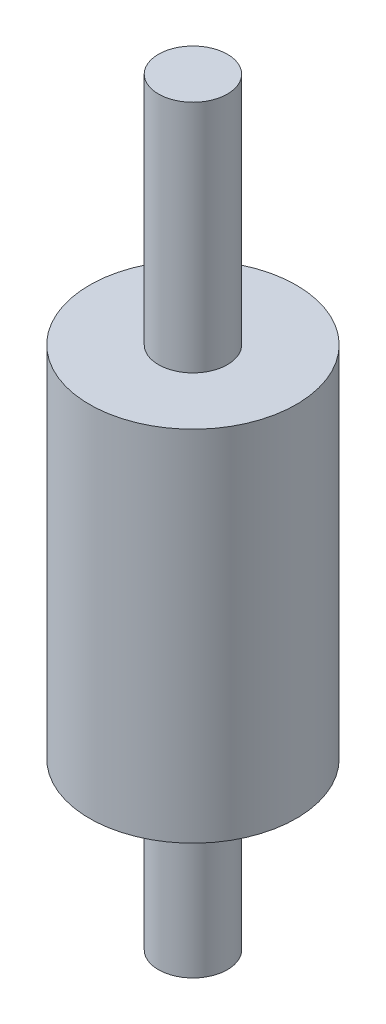
ISO-10303-21;
HEADER;
FILE_DESCRIPTION(('STEP AP214'),'2;1');
FILE_NAME('part.step','',(''),(''),'','','');
FILE_SCHEMA(('AUTOMOTIVE_DESIGN { 1 0 10303 214 1 1 1 1 }'));
ENDSEC;
DATA;
#1=APPLICATION_CONTEXT('core data for automotive mechanical design processes');
#2=APPLICATION_PROTOCOL_DEFINITION('international standard','automotive_design',2000,#1);
#3=PRODUCT_CONTEXT('',#1,'mechanical');
#4=PRODUCT('Part','Part','',(#3));
#5=PRODUCT_RELATED_PRODUCT_CATEGORY('part','',(#4));
#6=PRODUCT_DEFINITION_FORMATION('','',#4);
#7=PRODUCT_DEFINITION_CONTEXT('part definition',#1,'design');
#8=PRODUCT_DEFINITION('design','',#6,#7);
#9=PRODUCT_DEFINITION_SHAPE('','',#8);
#10=(LENGTH_UNIT() NAMED_UNIT(*) SI_UNIT(.MILLI.,.METRE.));
#11=(NAMED_UNIT(*) PLANE_ANGLE_UNIT() SI_UNIT($,.RADIAN.));
#12=(NAMED_UNIT(*) SI_UNIT($,.STERADIAN.) SOLID_ANGLE_UNIT());
#13=UNCERTAINTY_MEASURE_WITH_UNIT(LENGTH_MEASURE(1.E-05),#10,'distance_accuracy_value','');
#14=(GEOMETRIC_REPRESENTATION_CONTEXT(3) GLOBAL_UNCERTAINTY_ASSIGNED_CONTEXT((#13)) GLOBAL_UNIT_ASSIGNED_CONTEXT((#10,
#11,#12)) REPRESENTATION_CONTEXT('',''));
#15=CARTESIAN_POINT('',(0.,0.,0.));
#16=DIRECTION('',(0.,0.,1.));
#17=DIRECTION('',(1.,0.,0.));
#18=AXIS2_PLACEMENT_3D('',#15,#16,#17);
#19=CARTESIAN_POINT('',(0.,-27.5,0.));
#20=DIRECTION('',(0.,-1.,0.));
#21=DIRECTION('',(0.,0.,-1.));
#22=AXIS2_PLACEMENT_3D('',#19,#20,#21);
#23=PLANE('',#22);
#24=CARTESIAN_POINT('',(0.,-27.5,0.));
#25=DIRECTION('',(0.,-1.,0.));
#26=DIRECTION('',(0.,0.,-1.));
#27=AXIS2_PLACEMENT_3D('',#24,#25,#26);
#28=CIRCLE('',#27,2.5);
#29=CARTESIAN_POINT('',(0.,-27.5,-2.5));
#30=VERTEX_POINT('',#29);
#31=EDGE_CURVE('E10',#30,#30,#28,.T.);
#32=ORIENTED_EDGE('',*,*,#31,.T.);
#33=EDGE_LOOP('',(#32));
#34=FACE_BOUND('',#33,.T.);
#35=ADVANCED_FACE('F39',(#34),#23,.T.);
#36=CARTESIAN_POINT('',(0.,0.,0.));
#37=DIRECTION('',(0.,-1.,0.));
#38=DIRECTION('',(0.,0.,-1.));
#39=AXIS2_PLACEMENT_3D('',#36,#37,#38);
#40=CYLINDRICAL_SURFACE('',#39,2.5);
#41=CARTESIAN_POINT('',(0.,-15.5,0.));
#42=DIRECTION('',(0.,-1.,0.));
#43=DIRECTION('',(0.,0.,-1.));
#44=AXIS2_PLACEMENT_3D('',#41,#42,#43);
#45=CIRCLE('',#44,2.5);
#46=CARTESIAN_POINT('',(0.,-15.5,-2.5));
#47=VERTEX_POINT('',#46);
#48=EDGE_CURVE('E46',#47,#47,#45,.T.);
#49=ORIENTED_EDGE('',*,*,#48,.T.);
#50=EDGE_LOOP('',(#49));
#51=FACE_BOUND('',#50,.T.);
#52=ORIENTED_EDGE('',*,*,#31,.F.);
#53=EDGE_LOOP('',(#52));
#54=FACE_BOUND('',#53,.T.);
#55=ADVANCED_FACE('F86',(#51,#54),#40,.T.);
#56=CARTESIAN_POINT('',(0.,-15.5,-2.5));
#57=DIRECTION('',(0.,-1.,0.));
#58=DIRECTION('',(0.,0.,-1.));
#59=AXIS2_PLACEMENT_3D('',#56,#57,#58);
#60=PLANE('',#59);
#61=CARTESIAN_POINT('',(0.,-15.5,0.));
#62=DIRECTION('',(0.,-1.,0.));
#63=DIRECTION('',(0.,0.,-1.));
#64=AXIS2_PLACEMENT_3D('',#61,#62,#63);
#65=CIRCLE('',#64,7.5);
#66=CARTESIAN_POINT('',(0.,-15.5,-7.5));
#67=VERTEX_POINT('',#66);
#68=EDGE_CURVE('E52',#67,#67,#65,.T.);
#69=ORIENTED_EDGE('',*,*,#68,.T.);
#70=EDGE_LOOP('',(#69));
#71=FACE_BOUND('',#70,.T.);
#72=ORIENTED_EDGE('',*,*,#48,.F.);
#73=EDGE_LOOP('',(#72));
#74=FACE_BOUND('',#73,.T.);
#75=ADVANCED_FACE('F90',(#71,#74),#60,.T.);
#76=CARTESIAN_POINT('',(0.,0.,0.));
#77=DIRECTION('',(0.,-1.,0.));
#78=DIRECTION('',(0.,0.,-1.));
#79=AXIS2_PLACEMENT_3D('',#76,#77,#78);
#80=CYLINDRICAL_SURFACE('',#79,7.5);
#81=CARTESIAN_POINT('',(0.,10.5,0.));
#82=DIRECTION('',(0.,-1.,0.));
#83=DIRECTION('',(0.,0.,-1.));
#84=AXIS2_PLACEMENT_3D('',#81,#82,#83);
#85=CIRCLE('',#84,7.5);
#86=CARTESIAN_POINT('',(0.,10.5,-7.5));
#87=VERTEX_POINT('',#86);
#88=EDGE_CURVE('E58',#87,#87,#85,.T.);
#89=ORIENTED_EDGE('',*,*,#88,.T.);
#90=EDGE_LOOP('',(#89));
#91=FACE_BOUND('',#90,.T.);
#92=ORIENTED_EDGE('',*,*,#68,.F.);
#93=EDGE_LOOP('',(#92));
#94=FACE_BOUND('',#93,.T.);
#95=ADVANCED_FACE('F94',(#91,#94),#80,.T.);
#96=CARTESIAN_POINT('',(0.,10.5,-7.5));
#97=DIRECTION('',(0.,1.,0.));
#98=DIRECTION('',(0.,0.,1.));
#99=AXIS2_PLACEMENT_3D('',#96,#97,#98);
#100=PLANE('',#99);
#101=CARTESIAN_POINT('',(0.,10.5,0.));
#102=DIRECTION('',(0.,-1.,0.));
#103=DIRECTION('',(0.,0.,-1.));
#104=AXIS2_PLACEMENT_3D('',#101,#102,#103);
#105=CIRCLE('',#104,2.5);
#106=CARTESIAN_POINT('',(0.,10.5,-2.5));
#107=VERTEX_POINT('',#106);
#108=EDGE_CURVE('E64',#107,#107,#105,.T.);
#109=ORIENTED_EDGE('',*,*,#108,.T.);
#110=EDGE_LOOP('',(#109));
#111=FACE_BOUND('',#110,.T.);
#112=ORIENTED_EDGE('',*,*,#88,.F.);
#113=EDGE_LOOP('',(#112));
#114=FACE_BOUND('',#113,.T.);
#115=ADVANCED_FACE('F83',(#111,#114),#100,.T.);
#116=CARTESIAN_POINT('',(0.,0.,0.));
#117=DIRECTION('',(0.,-1.,0.));
#118=DIRECTION('',(0.,0.,-1.));
#119=AXIS2_PLACEMENT_3D('',#116,#117,#118);
#120=CYLINDRICAL_SURFACE('',#119,2.5);
#121=CARTESIAN_POINT('',(0.,27.5,0.));
#122=DIRECTION('',(0.,-1.,0.));
#123=DIRECTION('',(0.,0.,-1.));
#124=AXIS2_PLACEMENT_3D('',#121,#122,#123);
#125=CIRCLE('',#124,2.5);
#126=CARTESIAN_POINT('',(0.,27.5,-2.5));
#127=VERTEX_POINT('',#126);
#128=EDGE_CURVE('E68',#127,#127,#125,.T.);
#129=ORIENTED_EDGE('',*,*,#128,.T.);
#130=EDGE_LOOP('',(#129));
#131=FACE_BOUND('',#130,.T.);
#132=ORIENTED_EDGE('',*,*,#108,.F.);
#133=EDGE_LOOP('',(#132));
#134=FACE_BOUND('',#133,.T.);
#135=ADVANCED_FACE('F74',(#131,#134),#120,.T.);
#136=CARTESIAN_POINT('',(0.,27.5,-2.5));
#137=DIRECTION('',(0.,1.,0.));
#138=DIRECTION('',(0.,0.,1.));
#139=AXIS2_PLACEMENT_3D('',#136,#137,#138);
#140=PLANE('',#139);
#141=ORIENTED_EDGE('',*,*,#128,.F.);
#142=EDGE_LOOP('',(#141));
#143=FACE_BOUND('',#142,.T.);
#144=ADVANCED_FACE('F77',(#143),#140,.T.);
#145=CLOSED_SHELL('',(#35,#55,#75,#95,#115,#135,#144));
#146=MANIFOLD_SOLID_BREP('B2',#145);
#147=ADVANCED_BREP_SHAPE_REPRESENTATION('',(#18,#146),#14);
#148=SHAPE_DEFINITION_REPRESENTATION(#9,#147);
ENDSEC;
END-ISO-10303-21;
